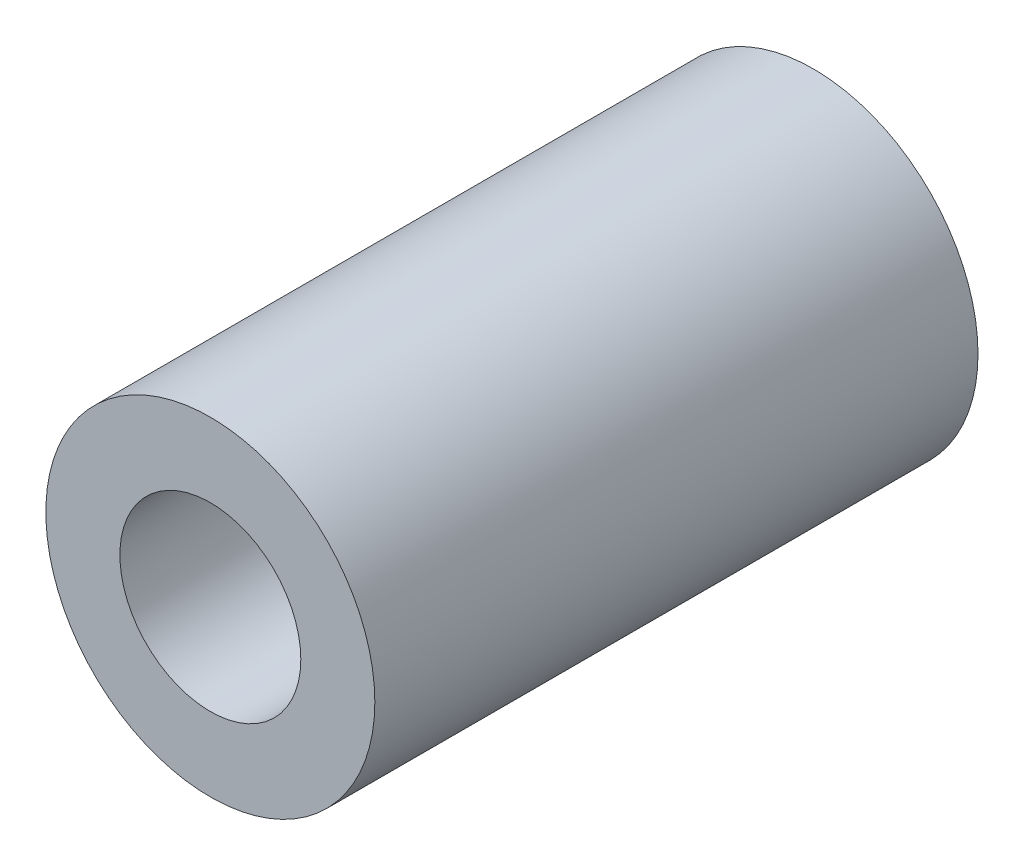
ISO-10303-21;
HEADER;
FILE_DESCRIPTION(('STEP AP214'),'2;1');
FILE_NAME('part.step','',(''),(''),'','','');
FILE_SCHEMA(('AUTOMOTIVE_DESIGN { 1 0 10303 214 1 1 1 1 }'));
ENDSEC;
DATA;
#1=APPLICATION_CONTEXT('core data for automotive mechanical design processes');
#2=APPLICATION_PROTOCOL_DEFINITION('international standard','automotive_design',2000,#1);
#3=PRODUCT_CONTEXT('',#1,'mechanical');
#4=PRODUCT('Part','Part','',(#3));
#5=PRODUCT_RELATED_PRODUCT_CATEGORY('part','',(#4));
#6=PRODUCT_DEFINITION_FORMATION('','',#4);
#7=PRODUCT_DEFINITION_CONTEXT('part definition',#1,'design');
#8=PRODUCT_DEFINITION('design','',#6,#7);
#9=PRODUCT_DEFINITION_SHAPE('','',#8);
#10=(LENGTH_UNIT() NAMED_UNIT(*) SI_UNIT(.MILLI.,.METRE.));
#11=(NAMED_UNIT(*) PLANE_ANGLE_UNIT() SI_UNIT($,.RADIAN.));
#12=(NAMED_UNIT(*) SI_UNIT($,.STERADIAN.) SOLID_ANGLE_UNIT());
#13=UNCERTAINTY_MEASURE_WITH_UNIT(LENGTH_MEASURE(1.E-05),#10,'distance_accuracy_value','');
#14=(GEOMETRIC_REPRESENTATION_CONTEXT(3) GLOBAL_UNCERTAINTY_ASSIGNED_CONTEXT((#13)) GLOBAL_UNIT_ASSIGNED_CONTEXT((#10,
#11,#12)) REPRESENTATION_CONTEXT('',''));
#15=CARTESIAN_POINT('',(0.,0.,0.));
#16=DIRECTION('',(0.,0.,1.));
#17=DIRECTION('',(1.,0.,0.));
#18=AXIS2_PLACEMENT_3D('',#15,#16,#17);
#19=CARTESIAN_POINT('',(0.,0.,11.));
#20=DIRECTION('',(0.,0.,1.));
#21=DIRECTION('',(1.,0.,0.));
#22=AXIS2_PLACEMENT_3D('',#19,#20,#21);
#23=PLANE('',#22);
#24=CARTESIAN_POINT('',(0.,0.,11.));
#25=DIRECTION('',(0.,0.,1.));
#26=DIRECTION('',(1.,0.,0.));
#27=AXIS2_PLACEMENT_3D('',#24,#25,#26);
#28=CIRCLE('',#27,3.);
#29=CARTESIAN_POINT('',(3.,0.,11.));
#30=VERTEX_POINT('',#29);
#31=EDGE_CURVE('E10',#30,#30,#28,.T.);
#32=ORIENTED_EDGE('',*,*,#31,.T.);
#33=EDGE_LOOP('',(#32));
#34=FACE_BOUND('',#33,.T.);
#35=CARTESIAN_POINT('',(0.,0.,11.));
#36=DIRECTION('',(0.,0.,1.));
#37=DIRECTION('',(1.,0.,0.));
#38=AXIS2_PLACEMENT_3D('',#35,#36,#37);
#39=CIRCLE('',#38,1.65);
#40=CARTESIAN_POINT('',(1.65,0.,11.));
#41=VERTEX_POINT('',#40);
#42=EDGE_CURVE('E44',#41,#41,#39,.T.);
#43=ORIENTED_EDGE('',*,*,#42,.F.);
#44=EDGE_LOOP('',(#43));
#45=FACE_BOUND('',#44,.T.);
#46=ADVANCED_FACE('F33',(#34,#45),#23,.T.);
#47=CARTESIAN_POINT('',(0.,0.,0.));
#48=DIRECTION('',(0.,0.,1.));
#49=DIRECTION('',(1.,0.,0.));
#50=AXIS2_PLACEMENT_3D('',#47,#48,#49);
#51=PLANE('',#50);
#52=CARTESIAN_POINT('',(0.,0.,0.));
#53=DIRECTION('',(0.,0.,1.));
#54=DIRECTION('',(1.,0.,0.));
#55=AXIS2_PLACEMENT_3D('',#52,#53,#54);
#56=CIRCLE('',#55,3.);
#57=CARTESIAN_POINT('',(3.,0.,0.));
#58=VERTEX_POINT('',#57);
#59=EDGE_CURVE('E37',#58,#58,#56,.T.);
#60=ORIENTED_EDGE('',*,*,#59,.F.);
#61=EDGE_LOOP('',(#60));
#62=FACE_BOUND('',#61,.T.);
#63=CARTESIAN_POINT('',(0.,0.,0.));
#64=DIRECTION('',(0.,0.,1.));
#65=DIRECTION('',(1.,0.,0.));
#66=AXIS2_PLACEMENT_3D('',#63,#64,#65);
#67=CIRCLE('',#66,1.65);
#68=CARTESIAN_POINT('',(1.65,0.,0.));
#69=VERTEX_POINT('',#68);
#70=EDGE_CURVE('E46',#69,#69,#67,.T.);
#71=ORIENTED_EDGE('',*,*,#70,.T.);
#72=EDGE_LOOP('',(#71));
#73=FACE_BOUND('',#72,.T.);
#74=ADVANCED_FACE('F56',(#62,#73),#51,.F.);
#75=CARTESIAN_POINT('',(0.,0.,11.));
#76=DIRECTION('',(0.,0.,-1.));
#77=DIRECTION('',(-1.,0.,0.));
#78=AXIS2_PLACEMENT_3D('',#75,#76,#77);
#79=CYLINDRICAL_SURFACE('',#78,3.);
#80=ORIENTED_EDGE('',*,*,#31,.F.);
#81=EDGE_LOOP('',(#80));
#82=FACE_BOUND('',#81,.T.);
#83=ORIENTED_EDGE('',*,*,#59,.T.);
#84=EDGE_LOOP('',(#83));
#85=FACE_BOUND('',#84,.T.);
#86=ADVANCED_FACE('F35',(#82,#85),#79,.T.);
#87=CARTESIAN_POINT('',(0.,0.,11.));
#88=DIRECTION('',(0.,0.,-1.));
#89=DIRECTION('',(-1.,0.,0.));
#90=AXIS2_PLACEMENT_3D('',#87,#88,#89);
#91=CYLINDRICAL_SURFACE('',#90,1.65);
#92=ORIENTED_EDGE('',*,*,#42,.T.);
#93=EDGE_LOOP('',(#92));
#94=FACE_BOUND('',#93,.T.);
#95=ORIENTED_EDGE('',*,*,#70,.F.);
#96=EDGE_LOOP('',(#95));
#97=FACE_BOUND('',#96,.T.);
#98=ADVANCED_FACE('F52',(#94,#97),#91,.F.);
#99=CLOSED_SHELL('',(#46,#74,#86,#98));
#100=MANIFOLD_SOLID_BREP('B2',#99);
#101=ADVANCED_BREP_SHAPE_REPRESENTATION('',(#18,#100),#14);
#102=SHAPE_DEFINITION_REPRESENTATION(#9,#101);
ENDSEC;
END-ISO-10303-21;
